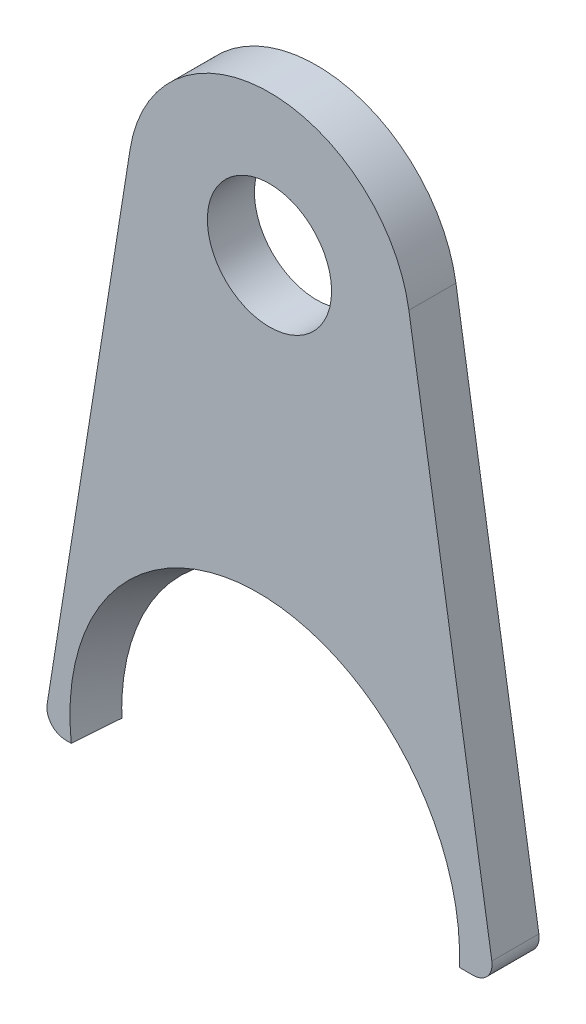
ISO-10303-21;
HEADER;
FILE_DESCRIPTION(('STEP AP214'),'2;1');
FILE_NAME('part.step','',(''),(''),'','','');
FILE_SCHEMA(('AUTOMOTIVE_DESIGN { 1 0 10303 214 1 1 1 1 }'));
ENDSEC;
DATA;
#1=APPLICATION_CONTEXT('core data for automotive mechanical design processes');
#2=APPLICATION_PROTOCOL_DEFINITION('international standard','automotive_design',2000,#1);
#3=PRODUCT_CONTEXT('',#1,'mechanical');
#4=PRODUCT('Part','Part','',(#3));
#5=PRODUCT_RELATED_PRODUCT_CATEGORY('part','',(#4));
#6=PRODUCT_DEFINITION_FORMATION('','',#4);
#7=PRODUCT_DEFINITION_CONTEXT('part definition',#1,'design');
#8=PRODUCT_DEFINITION('design','',#6,#7);
#9=PRODUCT_DEFINITION_SHAPE('','',#8);
#10=(LENGTH_UNIT() NAMED_UNIT(*) SI_UNIT(.MILLI.,.METRE.));
#11=(NAMED_UNIT(*) PLANE_ANGLE_UNIT() SI_UNIT($,.RADIAN.));
#12=(NAMED_UNIT(*) SI_UNIT($,.STERADIAN.) SOLID_ANGLE_UNIT());
#13=UNCERTAINTY_MEASURE_WITH_UNIT(LENGTH_MEASURE(1.E-05),#10,'distance_accuracy_value','');
#14=(GEOMETRIC_REPRESENTATION_CONTEXT(3) GLOBAL_UNCERTAINTY_ASSIGNED_CONTEXT((#13)) GLOBAL_UNIT_ASSIGNED_CONTEXT((#10,
#11,#12)) REPRESENTATION_CONTEXT('',''));
#15=CARTESIAN_POINT('',(0.,0.,0.));
#16=DIRECTION('',(0.,0.,1.));
#17=DIRECTION('',(1.,0.,0.));
#18=AXIS2_PLACEMENT_3D('',#15,#16,#17);
#19=CARTESIAN_POINT('',(0.,-35.211766,3.175));
#20=DIRECTION('',(0.,1.,0.));
#21=DIRECTION('',(-1.,0.,0.));
#22=AXIS2_PLACEMENT_3D('',#19,#20,#21);
#23=PLANE('',#22);
#24=DIRECTION('',(1.,0.,0.));
#25=VECTOR('',#24,1.);
#26=CARTESIAN_POINT('',(0.,-35.211766,0.));
#27=LINE('',#26,#25);
#28=CARTESIAN_POINT('',(13.1394340026446,-35.211766,0.));
#29=VERTEX_POINT('',#28);
#30=CARTESIAN_POINT('',(13.7522496650488,-35.211766,0.));
#31=VERTEX_POINT('',#30);
#32=EDGE_CURVE('E212',#29,#31,#27,.T.);
#33=ORIENTED_EDGE('',*,*,#32,.T.);
#34=DIRECTION('',(0.,0.,-1.));
#35=VECTOR('',#34,1.);
#36=CARTESIAN_POINT('',(13.7522496650488,-35.211766,3.175));
#37=LINE('',#36,#35);
#38=CARTESIAN_POINT('',(13.7522496650488,-35.211766,3.175));
#39=VERTEX_POINT('',#38);
#40=EDGE_CURVE('E12',#31,#39,#37,.F.);
#41=ORIENTED_EDGE('',*,*,#40,.T.);
#42=DIRECTION('',(1.,0.,0.));
#43=VECTOR('',#42,1.);
#44=CARTESIAN_POINT('',(0.,-35.211766,3.175));
#45=LINE('',#44,#43);
#46=CARTESIAN_POINT('',(12.8114151936818,-35.211766,3.175));
#47=VERTEX_POINT('',#46);
#48=EDGE_CURVE('E251',#47,#39,#45,.T.);
#49=ORIENTED_EDGE('',*,*,#48,.F.);
#50=CARTESIAN_POINT('',(0.00476535947638301,-35.211766,-0.0475119253614542));
#51=DIRECTION('',(0.,1.,0.));
#52=DIRECTION('',(0.0997974651310145,0.,-0.995007771805539));
#53=AXIS2_PLACEMENT_3D('',#50,#51,#52);
#54=ELLIPSE('',#53,38.1911531206193,13.081);
#55=EDGE_CURVE('E222',#29,#47,#54,.F.);
#56=ORIENTED_EDGE('',*,*,#55,.F.);
#57=EDGE_LOOP('',(#33,#41,#49,#56));
#58=FACE_BOUND('',#57,.T.);
#59=ADVANCED_FACE('F134',(#58),#23,.F.);
#60=CARTESIAN_POINT('',(-9.40696698253595,1.49485691271059,3.175));
#61=DIRECTION('',(-0.987608082156004,0.156940358289825,0.));
#62=DIRECTION('',(-0.156940358289825,-0.987608082156004,0.));
#63=AXIS2_PLACEMENT_3D('',#60,#61,#62);
#64=PLANE('',#63);
#65=DIRECTION('',(0.156940358289825,0.987608082156004,0.));
#66=VECTOR('',#65,1.);
#67=CARTESIAN_POINT('',(-9.40696698253595,1.49485691271059,0.));
#68=LINE('',#67,#66);
#69=CARTESIAN_POINT('',(-15.006511929387,-33.7424517449719,0.));
#70=VERTEX_POINT('',#69);
#71=CARTESIAN_POINT('',(-9.40696698253595,1.49485691271059,0.));
#72=VERTEX_POINT('',#71);
#73=EDGE_CURVE('E238',#70,#72,#68,.T.);
#74=ORIENTED_EDGE('',*,*,#73,.F.);
#75=DIRECTION('',(0.,0.,-1.));
#76=VECTOR('',#75,1.);
#77=CARTESIAN_POINT('',(-15.006511929387,-33.7424517449719,3.175));
#78=LINE('',#77,#76);
#79=CARTESIAN_POINT('',(-15.006511929387,-33.7424517449719,3.175));
#80=VERTEX_POINT('',#79);
#81=EDGE_CURVE('E260',#70,#80,#78,.F.);
#82=ORIENTED_EDGE('',*,*,#81,.T.);
#83=DIRECTION('',(0.156940358289825,0.987608082156004,0.));
#84=VECTOR('',#83,1.);
#85=CARTESIAN_POINT('',(-9.40696698253595,1.49485691271059,3.175));
#86=LINE('',#85,#84);
#87=CARTESIAN_POINT('',(-9.40696698253595,1.49485691271059,3.175));
#88=VERTEX_POINT('',#87);
#89=EDGE_CURVE('E235',#80,#88,#86,.T.);
#90=ORIENTED_EDGE('',*,*,#89,.T.);
#91=DIRECTION('',(0.,0.,-1.));
#92=VECTOR('',#91,1.);
#93=CARTESIAN_POINT('',(-9.40696698253595,1.49485691271059,3.175));
#94=LINE('',#93,#92);
#95=EDGE_CURVE('E210',#88,#72,#94,.T.);
#96=ORIENTED_EDGE('',*,*,#95,.T.);
#97=EDGE_LOOP('',(#74,#82,#90,#96));
#98=FACE_BOUND('',#97,.T.);
#99=ADVANCED_FACE('F285',(#98),#64,.T.);
#100=CARTESIAN_POINT('',(-13.7522496650488,-35.211766,3.175));
#101=VERTEX_POINT('',#100);
#102=CARTESIAN_POINT('',(-13.3718002828236,-35.211766,3.175));
#103=VERTEX_POINT('',#102);
#104=EDGE_CURVE('E246',#101,#103,#45,.T.);
#105=ORIENTED_EDGE('',*,*,#104,.F.);
#106=DIRECTION('',(0.,0.,-1.));
#107=VECTOR('',#106,1.);
#108=CARTESIAN_POINT('',(-13.7522496650488,-35.211766,0.));
#109=LINE('',#108,#107);
#110=CARTESIAN_POINT('',(-13.7522496650488,-35.211766,0.));
#111=VERTEX_POINT('',#110);
#112=EDGE_CURVE('E206',#101,#111,#109,.T.);
#113=ORIENTED_EDGE('',*,*,#112,.T.);
#114=CARTESIAN_POINT('',(-13.1383059825689,-35.211766,0.));
#115=VERTEX_POINT('',#114);
#116=EDGE_CURVE('E200',#111,#115,#27,.T.);
#117=ORIENTED_EDGE('',*,*,#116,.T.);
#118=EDGE_CURVE('E204',#103,#115,#54,.F.);
#119=ORIENTED_EDGE('',*,*,#118,.F.);
#120=EDGE_LOOP('',(#105,#113,#117,#119));
#121=FACE_BOUND('',#120,.T.);
#122=ADVANCED_FACE('F203',(#121),#23,.F.);
#123=CARTESIAN_POINT('',(9.40696698253595,1.49485691271059,3.175));
#124=DIRECTION('',(-0.987608082156004,-0.156940358289826,0.));
#125=DIRECTION('',(0.156940358289826,-0.987608082156004,0.));
#126=AXIS2_PLACEMENT_3D('',#123,#124,#125);
#127=PLANE('',#126);
#128=DIRECTION('',(-0.156940358289826,0.987608082156004,0.));
#129=VECTOR('',#128,1.);
#130=CARTESIAN_POINT('',(9.40696698253595,1.49485691271059,3.175));
#131=LINE('',#130,#129);
#132=CARTESIAN_POINT('',(15.006511929387,-33.7424517449719,3.175));
#133=VERTEX_POINT('',#132);
#134=CARTESIAN_POINT('',(9.40696698253595,1.49485691271059,3.175));
#135=VERTEX_POINT('',#134);
#136=EDGE_CURVE('E249',#133,#135,#131,.T.);
#137=ORIENTED_EDGE('',*,*,#136,.F.);
#138=DIRECTION('',(0.,0.,-1.));
#139=VECTOR('',#138,1.);
#140=CARTESIAN_POINT('',(15.006511929387,-33.7424517449719,3.175));
#141=LINE('',#140,#139);
#142=CARTESIAN_POINT('',(15.006511929387,-33.7424517449719,0.));
#143=VERTEX_POINT('',#142);
#144=EDGE_CURVE('E142',#133,#143,#141,.T.);
#145=ORIENTED_EDGE('',*,*,#144,.T.);
#146=DIRECTION('',(-0.156940358289826,0.987608082156004,0.));
#147=VECTOR('',#146,1.);
#148=CARTESIAN_POINT('',(9.40696698253595,1.49485691271059,0.));
#149=LINE('',#148,#147);
#150=CARTESIAN_POINT('',(9.40696698253595,1.49485691271059,0.));
#151=VERTEX_POINT('',#150);
#152=EDGE_CURVE('E209',#143,#151,#149,.T.);
#153=ORIENTED_EDGE('',*,*,#152,.T.);
#154=DIRECTION('',(0.,0.,-1.));
#155=VECTOR('',#154,1.);
#156=CARTESIAN_POINT('',(9.40696698253595,1.49485691271059,3.175));
#157=LINE('',#156,#155);
#158=EDGE_CURVE('E228',#135,#151,#157,.T.);
#159=ORIENTED_EDGE('',*,*,#158,.F.);
#160=EDGE_LOOP('',(#137,#145,#153,#159));
#161=FACE_BOUND('',#160,.T.);
#162=ADVANCED_FACE('F268',(#161),#127,.F.);
#163=CARTESIAN_POINT('',(0.,0.,3.175));
#164=DIRECTION('',(0.,0.,-1.));
#165=DIRECTION('',(-1.,0.,0.));
#166=AXIS2_PLACEMENT_3D('',#163,#164,#165);
#167=CYLINDRICAL_SURFACE('',#166,9.525);
#168=CARTESIAN_POINT('',(0.,0.,0.));
#169=DIRECTION('',(0.,0.,1.));
#170=DIRECTION('',(1.,0.,0.));
#171=AXIS2_PLACEMENT_3D('',#168,#169,#170);
#172=CIRCLE('',#171,9.525);
#173=EDGE_CURVE('E232',#151,#72,#172,.T.);
#174=ORIENTED_EDGE('',*,*,#173,.T.);
#175=ORIENTED_EDGE('',*,*,#95,.F.);
#176=CARTESIAN_POINT('',(0.,0.,3.175));
#177=DIRECTION('',(0.,0.,1.));
#178=DIRECTION('',(1.,0.,0.));
#179=AXIS2_PLACEMENT_3D('',#176,#177,#178);
#180=CIRCLE('',#179,9.525);
#181=EDGE_CURVE('E243',#135,#88,#180,.T.);
#182=ORIENTED_EDGE('',*,*,#181,.F.);
#183=ORIENTED_EDGE('',*,*,#158,.T.);
#184=EDGE_LOOP('',(#174,#175,#182,#183));
#185=FACE_BOUND('',#184,.T.);
#186=ADVANCED_FACE('F275',(#185),#167,.T.);
#187=CARTESIAN_POINT('',(0.,0.,3.175));
#188=DIRECTION('',(0.,0.,-1.));
#189=DIRECTION('',(-1.,0.,0.));
#190=AXIS2_PLACEMENT_3D('',#187,#188,#189);
#191=CYLINDRICAL_SURFACE('',#190,4.191);
#192=CARTESIAN_POINT('',(0.,0.,3.175));
#193=DIRECTION('',(0.,0.,1.));
#194=DIRECTION('',(1.,0.,0.));
#195=AXIS2_PLACEMENT_3D('',#192,#193,#194);
#196=CIRCLE('',#195,4.191);
#197=CARTESIAN_POINT('',(4.191,0.,3.175));
#198=VERTEX_POINT('',#197);
#199=EDGE_CURVE('E231',#198,#198,#196,.T.);
#200=ORIENTED_EDGE('',*,*,#199,.T.);
#201=EDGE_LOOP('',(#200));
#202=FACE_BOUND('',#201,.T.);
#203=CARTESIAN_POINT('',(0.,0.,0.));
#204=DIRECTION('',(0.,0.,1.));
#205=DIRECTION('',(1.,0.,0.));
#206=AXIS2_PLACEMENT_3D('',#203,#204,#205);
#207=CIRCLE('',#206,4.191);
#208=CARTESIAN_POINT('',(4.191,0.,0.));
#209=VERTEX_POINT('',#208);
#210=EDGE_CURVE('E220',#209,#209,#207,.T.);
#211=ORIENTED_EDGE('',*,*,#210,.F.);
#212=EDGE_LOOP('',(#211));
#213=FACE_BOUND('',#212,.T.);
#214=ADVANCED_FACE('F298',(#202,#213),#191,.F.);
#215=CARTESIAN_POINT('',(0.,0.,3.175));
#216=DIRECTION('',(0.,0.,1.));
#217=DIRECTION('',(1.,0.,0.));
#218=AXIS2_PLACEMENT_3D('',#215,#216,#217);
#219=PLANE('',#218);
#220=ORIENTED_EDGE('',*,*,#89,.F.);
#221=CARTESIAN_POINT('',(-13.7522496650488,-33.941766,3.175));
#222=DIRECTION('',(0.,0.,1.));
#223=DIRECTION('',(1.,0.,0.));
#224=AXIS2_PLACEMENT_3D('',#221,#222,#223);
#225=CIRCLE('',#224,1.27);
#226=EDGE_CURVE('E263',#80,#101,#225,.T.);
#227=ORIENTED_EDGE('',*,*,#226,.T.);
#228=ORIENTED_EDGE('',*,*,#104,.T.);
#229=CARTESIAN_POINT('',(-0.318446710437376,-34.0310551677843,3.17500000000004));
#230=DIRECTION('',(0.,0.,1.));
#231=DIRECTION('',(0.264029713717794,-0.964514546429498,0.));
#232=AXIS2_PLACEMENT_3D('',#229,#230,#231);
#233=ELLIPSE('',#232,13.9930306632658,13.081);
#234=EDGE_CURVE('E219',#103,#47,#233,.F.);
#235=ORIENTED_EDGE('',*,*,#234,.T.);
#236=ORIENTED_EDGE('',*,*,#48,.T.);
#237=CARTESIAN_POINT('',(13.7522496650488,-33.941766,3.175));
#238=DIRECTION('',(0.,0.,1.));
#239=DIRECTION('',(1.,0.,0.));
#240=AXIS2_PLACEMENT_3D('',#237,#238,#239);
#241=CIRCLE('',#240,1.27);
#242=EDGE_CURVE('E149',#39,#133,#241,.T.);
#243=ORIENTED_EDGE('',*,*,#242,.T.);
#244=ORIENTED_EDGE('',*,*,#136,.T.);
#245=ORIENTED_EDGE('',*,*,#181,.T.);
#246=EDGE_LOOP('',(#220,#227,#228,#235,#236,#243,#244,#245));
#247=FACE_BOUND('',#246,.T.);
#248=ORIENTED_EDGE('',*,*,#199,.F.);
#249=EDGE_LOOP('',(#248));
#250=FACE_BOUND('',#249,.T.);
#251=ADVANCED_FACE('F278',(#247,#250),#219,.T.);
#252=CARTESIAN_POINT('',(0.,0.,0.));
#253=DIRECTION('',(0.,0.,1.));
#254=DIRECTION('',(1.,0.,0.));
#255=AXIS2_PLACEMENT_3D('',#252,#253,#254);
#256=PLANE('',#255);
#257=ORIENTED_EDGE('',*,*,#116,.F.);
#258=CARTESIAN_POINT('',(-13.7522496650488,-33.941766,0.));
#259=DIRECTION('',(0.,0.,1.));
#260=DIRECTION('',(1.,0.,0.));
#261=AXIS2_PLACEMENT_3D('',#258,#259,#260);
#262=CIRCLE('',#261,1.27);
#263=EDGE_CURVE('E258',#111,#70,#262,.F.);
#264=ORIENTED_EDGE('',*,*,#263,.T.);
#265=ORIENTED_EDGE('',*,*,#73,.T.);
#266=ORIENTED_EDGE('',*,*,#173,.F.);
#267=ORIENTED_EDGE('',*,*,#152,.F.);
#268=CARTESIAN_POINT('',(13.7522496650488,-33.941766,0.));
#269=DIRECTION('',(0.,0.,1.));
#270=DIRECTION('',(1.,0.,0.));
#271=AXIS2_PLACEMENT_3D('',#268,#269,#270);
#272=CIRCLE('',#271,1.27);
#273=EDGE_CURVE('E256',#143,#31,#272,.F.);
#274=ORIENTED_EDGE('',*,*,#273,.T.);
#275=ORIENTED_EDGE('',*,*,#32,.F.);
#276=CARTESIAN_POINT('',(-1.11022302462516E-13,-35.1943578891123,0.));
#277=DIRECTION('',(0.,0.,1.));
#278=DIRECTION('',(0.264029713717794,-0.964514546429498,0.));
#279=AXIS2_PLACEMENT_3D('',#276,#277,#278);
#280=ELLIPSE('',#279,13.9930306632658,13.081);
#281=EDGE_CURVE('E216',#115,#29,#280,.F.);
#282=ORIENTED_EDGE('',*,*,#281,.F.);
#283=EDGE_LOOP('',(#257,#264,#265,#266,#267,#274,#275,#282));
#284=FACE_BOUND('',#283,.T.);
#285=ORIENTED_EDGE('',*,*,#210,.T.);
#286=EDGE_LOOP('',(#285));
#287=FACE_BOUND('',#286,.T.);
#288=ADVANCED_FACE('F224',(#284,#287),#256,.F.);
#289=CARTESIAN_POINT('',(-68.993899624417,216.844016374224,687.887876143375));
#290=DIRECTION('',(0.0937609927809066,-0.342513879030733,-0.934822506631103));
#291=DIRECTION('',(0.902184120214388,-0.367856186909635,0.225267927111905));
#292=AXIS2_PLACEMENT_3D('',#289,#290,#291);
#293=CYLINDRICAL_SURFACE('',#292,13.081);
#294=ORIENTED_EDGE('',*,*,#118,.T.);
#295=ORIENTED_EDGE('',*,*,#281,.T.);
#296=ORIENTED_EDGE('',*,*,#55,.T.);
#297=ORIENTED_EDGE('',*,*,#234,.F.);
#298=EDGE_LOOP('',(#294,#295,#296,#297));
#299=FACE_BOUND('',#298,.T.);
#300=ADVANCED_FACE('F215',(#299),#293,.F.);
#301=CARTESIAN_POINT('',(-13.7522496650488,-33.941766,3.175));
#302=DIRECTION('',(0.,0.,1.));
#303=DIRECTION('',(1.,0.,0.));
#304=AXIS2_PLACEMENT_3D('',#301,#302,#303);
#305=CYLINDRICAL_SURFACE('',#304,1.27);
#306=ORIENTED_EDGE('',*,*,#226,.F.);
#307=ORIENTED_EDGE('',*,*,#81,.F.);
#308=ORIENTED_EDGE('',*,*,#263,.F.);
#309=ORIENTED_EDGE('',*,*,#112,.F.);
#310=EDGE_LOOP('',(#306,#307,#308,#309));
#311=FACE_BOUND('',#310,.T.);
#312=ADVANCED_FACE('F284',(#311),#305,.T.);
#313=CARTESIAN_POINT('',(13.7522496650488,-33.941766,3.175));
#314=DIRECTION('',(0.,0.,-1.));
#315=DIRECTION('',(-1.,0.,0.));
#316=AXIS2_PLACEMENT_3D('',#313,#314,#315);
#317=CYLINDRICAL_SURFACE('',#316,1.27);
#318=ORIENTED_EDGE('',*,*,#242,.F.);
#319=ORIENTED_EDGE('',*,*,#40,.F.);
#320=ORIENTED_EDGE('',*,*,#273,.F.);
#321=ORIENTED_EDGE('',*,*,#144,.F.);
#322=EDGE_LOOP('',(#318,#319,#320,#321));
#323=FACE_BOUND('',#322,.T.);
#324=ADVANCED_FACE('F136',(#323),#317,.T.);
#325=CLOSED_SHELL('',(#59,#99,#122,#162,#186,#214,#251,#288,#300,#312,#324));
#326=MANIFOLD_SOLID_BREP('B2',#325);
#327=ADVANCED_BREP_SHAPE_REPRESENTATION('',(#18,#326),#14);
#328=SHAPE_DEFINITION_REPRESENTATION(#9,#327);
ENDSEC;
END-ISO-10303-21;
